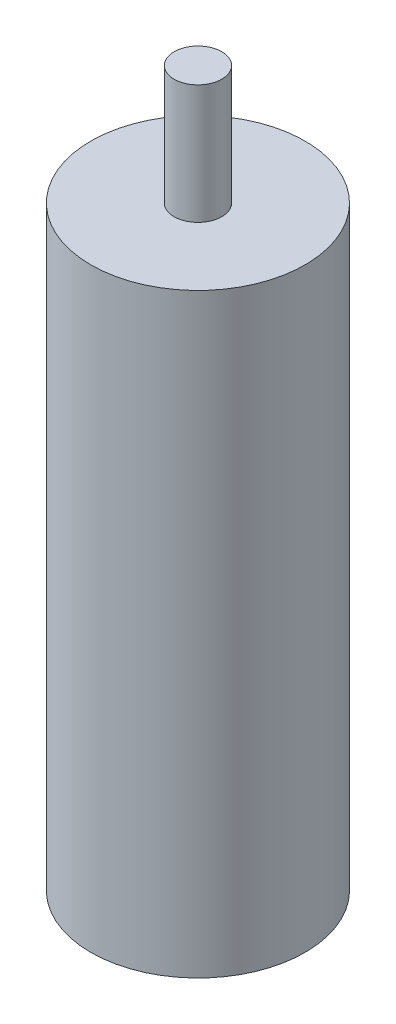
ISO-10303-21;
HEADER;
FILE_DESCRIPTION(('STEP AP214'),'2;1');
FILE_NAME('part.step','',(''),(''),'','','');
FILE_SCHEMA(('AUTOMOTIVE_DESIGN { 1 0 10303 214 1 1 1 1 }'));
ENDSEC;
DATA;
#1=APPLICATION_CONTEXT('core data for automotive mechanical design processes');
#2=APPLICATION_PROTOCOL_DEFINITION('international standard','automotive_design',2000,#1);
#3=PRODUCT_CONTEXT('',#1,'mechanical');
#4=PRODUCT('Part','Part','',(#3));
#5=PRODUCT_RELATED_PRODUCT_CATEGORY('part','',(#4));
#6=PRODUCT_DEFINITION_FORMATION('','',#4);
#7=PRODUCT_DEFINITION_CONTEXT('part definition',#1,'design');
#8=PRODUCT_DEFINITION('design','',#6,#7);
#9=PRODUCT_DEFINITION_SHAPE('','',#8);
#10=(LENGTH_UNIT() NAMED_UNIT(*) SI_UNIT(.MILLI.,.METRE.));
#11=(NAMED_UNIT(*) PLANE_ANGLE_UNIT() SI_UNIT($,.RADIAN.));
#12=(NAMED_UNIT(*) SI_UNIT($,.STERADIAN.) SOLID_ANGLE_UNIT());
#13=UNCERTAINTY_MEASURE_WITH_UNIT(LENGTH_MEASURE(1.E-05),#10,'distance_accuracy_value','');
#14=(GEOMETRIC_REPRESENTATION_CONTEXT(3) GLOBAL_UNCERTAINTY_ASSIGNED_CONTEXT((#13)) GLOBAL_UNIT_ASSIGNED_CONTEXT((#10,
#11,#12)) REPRESENTATION_CONTEXT('',''));
#15=CARTESIAN_POINT('',(0.,0.,0.));
#16=DIRECTION('',(0.,0.,1.));
#17=DIRECTION('',(1.,0.,0.));
#18=AXIS2_PLACEMENT_3D('',#15,#16,#17);
#19=CARTESIAN_POINT('',(0.,125.,0.));
#20=DIRECTION('',(0.,-1.,0.));
#21=DIRECTION('',(0.,0.,-1.));
#22=AXIS2_PLACEMENT_3D('',#19,#20,#21);
#23=CYLINDRICAL_SURFACE('',#22,22.5);
#24=CARTESIAN_POINT('',(0.,125.,0.));
#25=DIRECTION('',(0.,1.,0.));
#26=DIRECTION('',(0.,0.,1.));
#27=AXIS2_PLACEMENT_3D('',#24,#25,#26);
#28=CIRCLE('',#27,22.5);
#29=CARTESIAN_POINT('',(0.,125.,22.5));
#30=VERTEX_POINT('',#29);
#31=EDGE_CURVE('E10',#30,#30,#28,.T.);
#32=ORIENTED_EDGE('',*,*,#31,.F.);
#33=EDGE_LOOP('',(#32));
#34=FACE_BOUND('',#33,.T.);
#35=CARTESIAN_POINT('',(0.,0.,0.));
#36=DIRECTION('',(0.,1.,0.));
#37=DIRECTION('',(0.,0.,1.));
#38=AXIS2_PLACEMENT_3D('',#35,#36,#37);
#39=CIRCLE('',#38,22.5);
#40=CARTESIAN_POINT('',(0.,0.,22.5));
#41=VERTEX_POINT('',#40);
#42=EDGE_CURVE('E34',#41,#41,#39,.T.);
#43=ORIENTED_EDGE('',*,*,#42,.T.);
#44=EDGE_LOOP('',(#43));
#45=FACE_BOUND('',#44,.T.);
#46=ADVANCED_FACE('F31',(#34,#45),#23,.T.);
#47=CARTESIAN_POINT('',(0.,125.,0.));
#48=DIRECTION('',(0.,1.,0.));
#49=DIRECTION('',(0.,0.,1.));
#50=AXIS2_PLACEMENT_3D('',#47,#48,#49);
#51=PLANE('',#50);
#52=CARTESIAN_POINT('',(0.,125.,0.));
#53=DIRECTION('',(0.,1.,0.));
#54=DIRECTION('',(0.,0.,1.));
#55=AXIS2_PLACEMENT_3D('',#52,#53,#54);
#56=CIRCLE('',#55,5.);
#57=CARTESIAN_POINT('',(0.,125.,5.));
#58=VERTEX_POINT('',#57);
#59=EDGE_CURVE('E43',#58,#58,#56,.T.);
#60=ORIENTED_EDGE('',*,*,#59,.F.);
#61=EDGE_LOOP('',(#60));
#62=FACE_BOUND('',#61,.T.);
#63=ORIENTED_EDGE('',*,*,#31,.T.);
#64=EDGE_LOOP('',(#63));
#65=FACE_BOUND('',#64,.T.);
#66=ADVANCED_FACE('F58',(#62,#65),#51,.T.);
#67=CARTESIAN_POINT('',(0.,0.,0.));
#68=DIRECTION('',(0.,1.,0.));
#69=DIRECTION('',(0.,0.,1.));
#70=AXIS2_PLACEMENT_3D('',#67,#68,#69);
#71=PLANE('',#70);
#72=ORIENTED_EDGE('',*,*,#42,.F.);
#73=EDGE_LOOP('',(#72));
#74=FACE_BOUND('',#73,.T.);
#75=ADVANCED_FACE('F54',(#74),#71,.F.);
#76=CARTESIAN_POINT('',(0.,150.,0.));
#77=DIRECTION('',(0.,-1.,0.));
#78=DIRECTION('',(0.,0.,-1.));
#79=AXIS2_PLACEMENT_3D('',#76,#77,#78);
#80=CYLINDRICAL_SURFACE('',#79,5.);
#81=CARTESIAN_POINT('',(0.,150.,0.));
#82=DIRECTION('',(0.,1.,0.));
#83=DIRECTION('',(0.,0.,1.));
#84=AXIS2_PLACEMENT_3D('',#81,#82,#83);
#85=CIRCLE('',#84,5.);
#86=CARTESIAN_POINT('',(0.,150.,5.));
#87=VERTEX_POINT('',#86);
#88=EDGE_CURVE('E41',#87,#87,#85,.T.);
#89=ORIENTED_EDGE('',*,*,#88,.F.);
#90=EDGE_LOOP('',(#89));
#91=FACE_BOUND('',#90,.T.);
#92=ORIENTED_EDGE('',*,*,#59,.T.);
#93=EDGE_LOOP('',(#92));
#94=FACE_BOUND('',#93,.T.);
#95=ADVANCED_FACE('F51',(#91,#94),#80,.T.);
#96=CARTESIAN_POINT('',(0.,150.,0.));
#97=DIRECTION('',(0.,1.,0.));
#98=DIRECTION('',(0.,0.,1.));
#99=AXIS2_PLACEMENT_3D('',#96,#97,#98);
#100=PLANE('',#99);
#101=ORIENTED_EDGE('',*,*,#88,.T.);
#102=EDGE_LOOP('',(#101));
#103=FACE_BOUND('',#102,.T.);
#104=ADVANCED_FACE('F49',(#103),#100,.T.);
#105=CLOSED_SHELL('',(#46,#66,#75,#95,#104));
#106=MANIFOLD_SOLID_BREP('B2',#105);
#107=ADVANCED_BREP_SHAPE_REPRESENTATION('',(#18,#106),#14);
#108=SHAPE_DEFINITION_REPRESENTATION(#9,#107);
ENDSEC;
END-ISO-10303-21;
